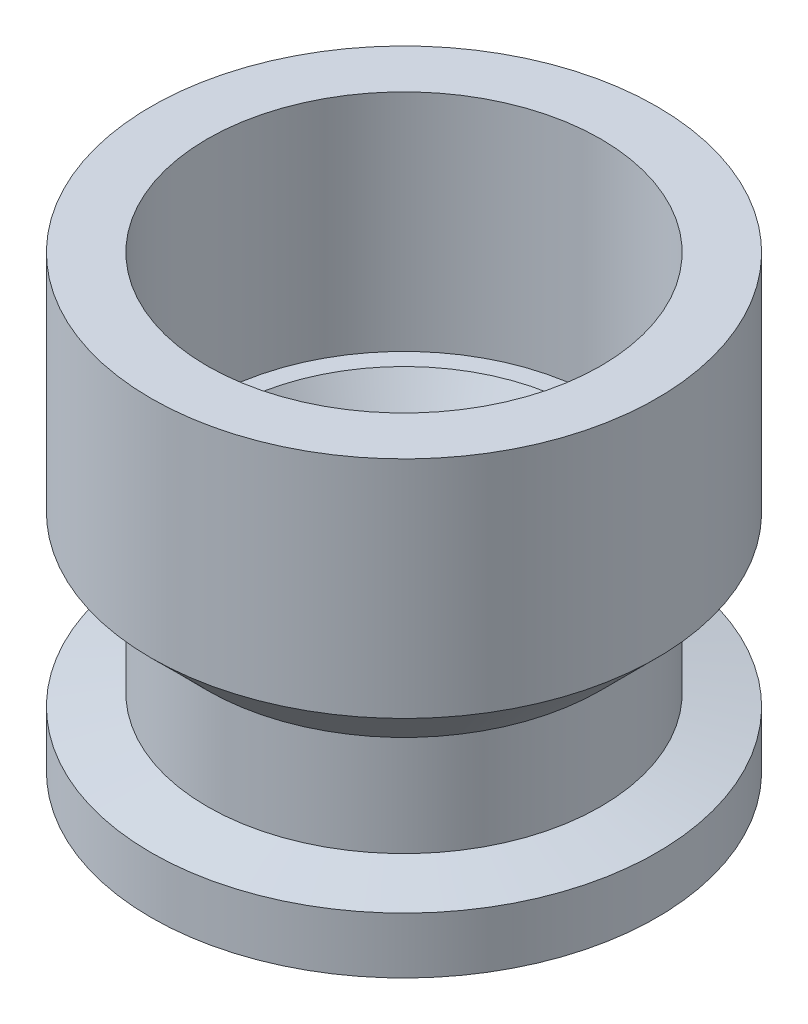
ISO-10303-21;
HEADER;
FILE_DESCRIPTION(('STEP AP214'),'2;1');
FILE_NAME('part.step','',(''),(''),'','','');
FILE_SCHEMA(('AUTOMOTIVE_DESIGN { 1 0 10303 214 1 1 1 1 }'));
ENDSEC;
DATA;
#1=APPLICATION_CONTEXT('core data for automotive mechanical design processes');
#2=APPLICATION_PROTOCOL_DEFINITION('international standard','automotive_design',2000,#1);
#3=PRODUCT_CONTEXT('',#1,'mechanical');
#4=PRODUCT('Part','Part','',(#3));
#5=PRODUCT_RELATED_PRODUCT_CATEGORY('part','',(#4));
#6=PRODUCT_DEFINITION_FORMATION('','',#4);
#7=PRODUCT_DEFINITION_CONTEXT('part definition',#1,'design');
#8=PRODUCT_DEFINITION('design','',#6,#7);
#9=PRODUCT_DEFINITION_SHAPE('','',#8);
#10=(LENGTH_UNIT() NAMED_UNIT(*) SI_UNIT(.MILLI.,.METRE.));
#11=(NAMED_UNIT(*) PLANE_ANGLE_UNIT() SI_UNIT($,.RADIAN.));
#12=(NAMED_UNIT(*) SI_UNIT($,.STERADIAN.) SOLID_ANGLE_UNIT());
#13=UNCERTAINTY_MEASURE_WITH_UNIT(LENGTH_MEASURE(1.E-05),#10,'distance_accuracy_value','');
#14=(GEOMETRIC_REPRESENTATION_CONTEXT(3) GLOBAL_UNCERTAINTY_ASSIGNED_CONTEXT((#13)) GLOBAL_UNIT_ASSIGNED_CONTEXT((#10,
#11,#12)) REPRESENTATION_CONTEXT('',''));
#15=CARTESIAN_POINT('',(0.,0.,0.));
#16=DIRECTION('',(0.,0.,1.));
#17=DIRECTION('',(1.,0.,0.));
#18=AXIS2_PLACEMENT_3D('',#15,#16,#17);
#19=CARTESIAN_POINT('',(0.,0.,0.));
#20=DIRECTION('',(0.,-1.,0.));
#21=DIRECTION('',(0.,0.,-1.));
#22=AXIS2_PLACEMENT_3D('',#19,#20,#21);
#23=CYLINDRICAL_SURFACE('',#22,4.5);
#24=CARTESIAN_POINT('',(0.,1.,0.));
#25=DIRECTION('',(0.,-1.,0.));
#26=DIRECTION('',(0.,0.,-1.));
#27=AXIS2_PLACEMENT_3D('',#24,#25,#26);
#28=CIRCLE('',#27,4.5);
#29=CARTESIAN_POINT('',(0.,1.,-4.5));
#30=VERTEX_POINT('',#29);
#31=EDGE_CURVE('E10',#30,#30,#28,.T.);
#32=ORIENTED_EDGE('',*,*,#31,.T.);
#33=EDGE_LOOP('',(#32));
#34=FACE_BOUND('',#33,.T.);
#35=CARTESIAN_POINT('',(0.,0.,0.));
#36=DIRECTION('',(0.,-1.,0.));
#37=DIRECTION('',(0.,0.,-1.));
#38=AXIS2_PLACEMENT_3D('',#35,#36,#37);
#39=CIRCLE('',#38,4.5);
#40=CARTESIAN_POINT('',(0.,0.,-4.5));
#41=VERTEX_POINT('',#40);
#42=EDGE_CURVE('E89',#41,#41,#39,.T.);
#43=ORIENTED_EDGE('',*,*,#42,.F.);
#44=EDGE_LOOP('',(#43));
#45=FACE_BOUND('',#44,.T.);
#46=ADVANCED_FACE('F43',(#34,#45),#23,.T.);
#47=CARTESIAN_POINT('',(0.,1.,0.));
#48=DIRECTION('',(0.,-1.,0.));
#49=DIRECTION('',(0.,0.,-1.));
#50=AXIS2_PLACEMENT_3D('',#47,#48,#49);
#51=CONICAL_SURFACE('',#50,4.5,1.36367284656431);
#52=CARTESIAN_POINT('',(0.,1.21013707950392,0.));
#53=DIRECTION('',(0.,-1.,0.));
#54=DIRECTION('',(0.,0.,-1.));
#55=AXIS2_PLACEMENT_3D('',#52,#53,#54);
#56=CIRCLE('',#55,3.5);
#57=CARTESIAN_POINT('',(0.,1.21013707950392,-3.5));
#58=VERTEX_POINT('',#57);
#59=EDGE_CURVE('E49',#58,#58,#56,.T.);
#60=ORIENTED_EDGE('',*,*,#59,.T.);
#61=EDGE_LOOP('',(#60));
#62=FACE_BOUND('',#61,.T.);
#63=ORIENTED_EDGE('',*,*,#31,.F.);
#64=EDGE_LOOP('',(#63));
#65=FACE_BOUND('',#64,.T.);
#66=ADVANCED_FACE('F97',(#62,#65),#51,.T.);
#67=CARTESIAN_POINT('',(0.,0.,0.));
#68=DIRECTION('',(0.,-1.,0.));
#69=DIRECTION('',(0.,0.,-1.));
#70=AXIS2_PLACEMENT_3D('',#67,#68,#69);
#71=CYLINDRICAL_SURFACE('',#70,3.5);
#72=CARTESIAN_POINT('',(0.,3.,0.));
#73=DIRECTION('',(0.,-1.,0.));
#74=DIRECTION('',(0.,0.,-1.));
#75=AXIS2_PLACEMENT_3D('',#72,#73,#74);
#76=CIRCLE('',#75,3.5);
#77=CARTESIAN_POINT('',(0.,3.,-3.5));
#78=VERTEX_POINT('',#77);
#79=EDGE_CURVE('E54',#78,#78,#76,.T.);
#80=ORIENTED_EDGE('',*,*,#79,.T.);
#81=EDGE_LOOP('',(#80));
#82=FACE_BOUND('',#81,.T.);
#83=ORIENTED_EDGE('',*,*,#59,.F.);
#84=EDGE_LOOP('',(#83));
#85=FACE_BOUND('',#84,.T.);
#86=ADVANCED_FACE('F103',(#82,#85),#71,.T.);
#87=CARTESIAN_POINT('',(0.,3.,0.));
#88=DIRECTION('',(0.,1.,0.));
#89=DIRECTION('',(0.,0.,1.));
#90=AXIS2_PLACEMENT_3D('',#87,#88,#89);
#91=CONICAL_SURFACE('',#90,3.5,0.78539816339745);
#92=CARTESIAN_POINT('',(0.,4.,0.));
#93=DIRECTION('',(0.,-1.,0.));
#94=DIRECTION('',(0.,0.,-1.));
#95=AXIS2_PLACEMENT_3D('',#92,#93,#94);
#96=CIRCLE('',#95,4.5);
#97=CARTESIAN_POINT('',(0.,4.,-4.5));
#98=VERTEX_POINT('',#97);
#99=EDGE_CURVE('E58',#98,#98,#96,.T.);
#100=ORIENTED_EDGE('',*,*,#99,.T.);
#101=EDGE_LOOP('',(#100));
#102=FACE_BOUND('',#101,.T.);
#103=ORIENTED_EDGE('',*,*,#79,.F.);
#104=EDGE_LOOP('',(#103));
#105=FACE_BOUND('',#104,.T.);
#106=ADVANCED_FACE('F110',(#102,#105),#91,.T.);
#107=CARTESIAN_POINT('',(0.,0.,0.));
#108=DIRECTION('',(0.,-1.,0.));
#109=DIRECTION('',(0.,0.,-1.));
#110=AXIS2_PLACEMENT_3D('',#107,#108,#109);
#111=CYLINDRICAL_SURFACE('',#110,4.5);
#112=CARTESIAN_POINT('',(0.,8.,0.));
#113=DIRECTION('',(0.,-1.,0.));
#114=DIRECTION('',(0.,0.,-1.));
#115=AXIS2_PLACEMENT_3D('',#112,#113,#114);
#116=CIRCLE('',#115,4.5);
#117=CARTESIAN_POINT('',(0.,8.,-4.5));
#118=VERTEX_POINT('',#117);
#119=EDGE_CURVE('E67',#118,#118,#116,.T.);
#120=ORIENTED_EDGE('',*,*,#119,.T.);
#121=EDGE_LOOP('',(#120));
#122=FACE_BOUND('',#121,.T.);
#123=ORIENTED_EDGE('',*,*,#99,.F.);
#124=EDGE_LOOP('',(#123));
#125=FACE_BOUND('',#124,.T.);
#126=ADVANCED_FACE('F111',(#122,#125),#111,.T.);
#127=CARTESIAN_POINT('',(4.5,8.,0.));
#128=DIRECTION('',(0.,1.,0.));
#129=DIRECTION('',(0.,0.,1.));
#130=AXIS2_PLACEMENT_3D('',#127,#128,#129);
#131=PLANE('',#130);
#132=CARTESIAN_POINT('',(0.,8.,0.));
#133=DIRECTION('',(0.,-1.,0.));
#134=DIRECTION('',(0.,0.,-1.));
#135=AXIS2_PLACEMENT_3D('',#132,#133,#134);
#136=CIRCLE('',#135,3.5);
#137=CARTESIAN_POINT('',(0.,8.,-3.5));
#138=VERTEX_POINT('',#137);
#139=EDGE_CURVE('E68',#138,#138,#136,.T.);
#140=ORIENTED_EDGE('',*,*,#139,.T.);
#141=EDGE_LOOP('',(#140));
#142=FACE_BOUND('',#141,.T.);
#143=ORIENTED_EDGE('',*,*,#119,.F.);
#144=EDGE_LOOP('',(#143));
#145=FACE_BOUND('',#144,.T.);
#146=ADVANCED_FACE('F119',(#142,#145),#131,.T.);
#147=CARTESIAN_POINT('',(0.,0.,0.));
#148=DIRECTION('',(0.,-1.,0.));
#149=DIRECTION('',(0.,0.,-1.));
#150=AXIS2_PLACEMENT_3D('',#147,#148,#149);
#151=CYLINDRICAL_SURFACE('',#150,3.5);
#152=CARTESIAN_POINT('',(0.,4.,0.));
#153=DIRECTION('',(0.,-1.,0.));
#154=DIRECTION('',(0.,0.,-1.));
#155=AXIS2_PLACEMENT_3D('',#152,#153,#154);
#156=CIRCLE('',#155,3.5);
#157=CARTESIAN_POINT('',(0.,4.,-3.5));
#158=VERTEX_POINT('',#157);
#159=EDGE_CURVE('E74',#158,#158,#156,.T.);
#160=ORIENTED_EDGE('',*,*,#159,.T.);
#161=EDGE_LOOP('',(#160));
#162=FACE_BOUND('',#161,.T.);
#163=ORIENTED_EDGE('',*,*,#139,.F.);
#164=EDGE_LOOP('',(#163));
#165=FACE_BOUND('',#164,.T.);
#166=ADVANCED_FACE('F125',(#162,#165),#151,.F.);
#167=CARTESIAN_POINT('',(3.5,4.,0.));
#168=DIRECTION('',(0.,1.,0.));
#169=DIRECTION('',(0.,0.,1.));
#170=AXIS2_PLACEMENT_3D('',#167,#168,#169);
#171=PLANE('',#170);
#172=CARTESIAN_POINT('',(0.,4.,0.));
#173=DIRECTION('',(0.,-1.,0.));
#174=DIRECTION('',(0.,0.,-1.));
#175=AXIS2_PLACEMENT_3D('',#172,#173,#174);
#176=CIRCLE('',#175,3.1710709477653);
#177=CARTESIAN_POINT('',(0.,4.,-3.1710709477653));
#178=VERTEX_POINT('',#177);
#179=EDGE_CURVE('E79',#178,#178,#176,.T.);
#180=ORIENTED_EDGE('',*,*,#179,.T.);
#181=EDGE_LOOP('',(#180));
#182=FACE_BOUND('',#181,.T.);
#183=ORIENTED_EDGE('',*,*,#159,.F.);
#184=EDGE_LOOP('',(#183));
#185=FACE_BOUND('',#184,.T.);
#186=ADVANCED_FACE('F127',(#182,#185),#171,.T.);
#187=CARTESIAN_POINT('',(0.,4.,0.));
#188=DIRECTION('',(0.,1.,0.));
#189=DIRECTION('',(0.,0.,1.));
#190=AXIS2_PLACEMENT_3D('',#187,#188,#189);
#191=CONICAL_SURFACE('',#190,3.1710709477653,0.529715921560608);
#192=CARTESIAN_POINT('',(0.,1.99999999999999,0.));
#193=DIRECTION('',(0.,-1.,0.));
#194=DIRECTION('',(0.,0.,-1.));
#195=AXIS2_PLACEMENT_3D('',#192,#193,#194);
#196=CIRCLE('',#195,2.);
#197=CARTESIAN_POINT('',(0.,1.99999999999999,-2.));
#198=VERTEX_POINT('',#197);
#199=EDGE_CURVE('E85',#198,#198,#196,.T.);
#200=ORIENTED_EDGE('',*,*,#199,.T.);
#201=EDGE_LOOP('',(#200));
#202=FACE_BOUND('',#201,.T.);
#203=ORIENTED_EDGE('',*,*,#179,.F.);
#204=EDGE_LOOP('',(#203));
#205=FACE_BOUND('',#204,.T.);
#206=ADVANCED_FACE('F128',(#202,#205),#191,.F.);
#207=CARTESIAN_POINT('',(0.,0.,0.));
#208=DIRECTION('',(0.,-1.,0.));
#209=DIRECTION('',(0.,0.,-1.));
#210=AXIS2_PLACEMENT_3D('',#207,#208,#209);
#211=CYLINDRICAL_SURFACE('',#210,2.);
#212=CARTESIAN_POINT('',(0.,0.,0.));
#213=DIRECTION('',(0.,-1.,0.));
#214=DIRECTION('',(0.,0.,-1.));
#215=AXIS2_PLACEMENT_3D('',#212,#213,#214);
#216=CIRCLE('',#215,2.);
#217=CARTESIAN_POINT('',(0.,0.,-2.));
#218=VERTEX_POINT('',#217);
#219=EDGE_CURVE('E88',#218,#218,#216,.T.);
#220=ORIENTED_EDGE('',*,*,#219,.T.);
#221=EDGE_LOOP('',(#220));
#222=FACE_BOUND('',#221,.T.);
#223=ORIENTED_EDGE('',*,*,#199,.F.);
#224=EDGE_LOOP('',(#223));
#225=FACE_BOUND('',#224,.T.);
#226=ADVANCED_FACE('F131',(#222,#225),#211,.F.);
#227=CARTESIAN_POINT('',(2.,0.,0.));
#228=DIRECTION('',(0.,-1.,0.));
#229=DIRECTION('',(0.,0.,-1.));
#230=AXIS2_PLACEMENT_3D('',#227,#228,#229);
#231=PLANE('',#230);
#232=ORIENTED_EDGE('',*,*,#42,.T.);
#233=EDGE_LOOP('',(#232));
#234=FACE_BOUND('',#233,.T.);
#235=ORIENTED_EDGE('',*,*,#219,.F.);
#236=EDGE_LOOP('',(#235));
#237=FACE_BOUND('',#236,.T.);
#238=ADVANCED_FACE('F92',(#234,#237),#231,.T.);
#239=CLOSED_SHELL('',(#46,#66,#86,#106,#126,#146,#166,#186,#206,#226,#238));
#240=MANIFOLD_SOLID_BREP('B2',#239);
#241=ADVANCED_BREP_SHAPE_REPRESENTATION('',(#18,#240),#14);
#242=SHAPE_DEFINITION_REPRESENTATION(#9,#241);
ENDSEC;
END-ISO-10303-21;
